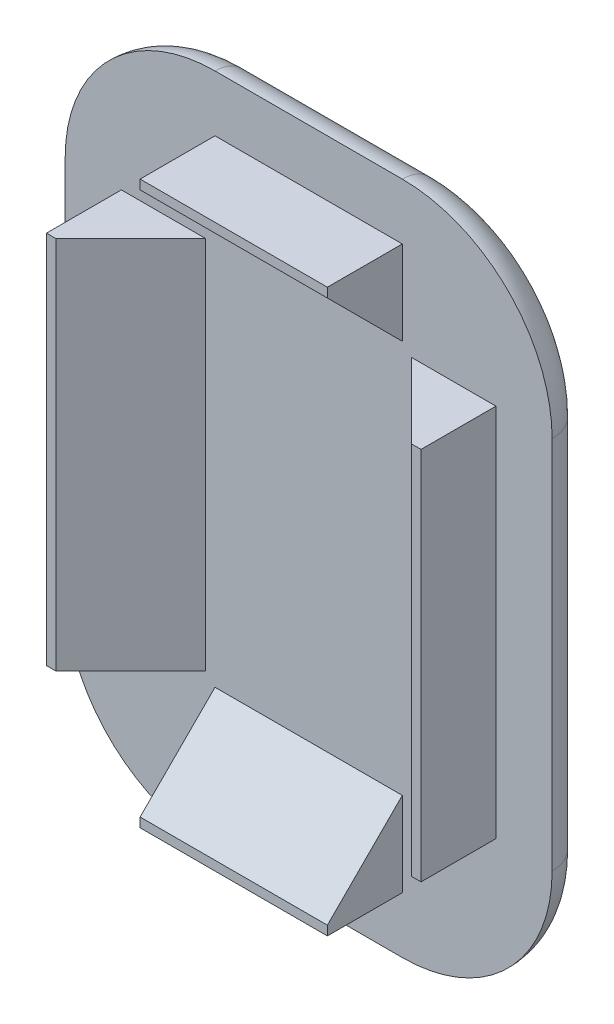
ISO-10303-21;
HEADER;
FILE_DESCRIPTION(('STEP AP214'),'2;1');
FILE_NAME('part.step','',(''),(''),'','','');
FILE_SCHEMA(('AUTOMOTIVE_DESIGN { 1 0 10303 214 1 1 1 1 }'));
ENDSEC;
DATA;
#1=APPLICATION_CONTEXT('core data for automotive mechanical design processes');
#2=APPLICATION_PROTOCOL_DEFINITION('international standard','automotive_design',2000,#1);
#3=PRODUCT_CONTEXT('',#1,'mechanical');
#4=PRODUCT('Part','Part','',(#3));
#5=PRODUCT_RELATED_PRODUCT_CATEGORY('part','',(#4));
#6=PRODUCT_DEFINITION_FORMATION('','',#4);
#7=PRODUCT_DEFINITION_CONTEXT('part definition',#1,'design');
#8=PRODUCT_DEFINITION('design','',#6,#7);
#9=PRODUCT_DEFINITION_SHAPE('','',#8);
#10=(LENGTH_UNIT() NAMED_UNIT(*) SI_UNIT(.MILLI.,.METRE.));
#11=(NAMED_UNIT(*) PLANE_ANGLE_UNIT() SI_UNIT($,.RADIAN.));
#12=(NAMED_UNIT(*) SI_UNIT($,.STERADIAN.) SOLID_ANGLE_UNIT());
#13=UNCERTAINTY_MEASURE_WITH_UNIT(LENGTH_MEASURE(1.E-05),#10,'distance_accuracy_value','');
#14=(GEOMETRIC_REPRESENTATION_CONTEXT(3) GLOBAL_UNCERTAINTY_ASSIGNED_CONTEXT((#13)) GLOBAL_UNIT_ASSIGNED_CONTEXT((#10,
#11,#12)) REPRESENTATION_CONTEXT('',''));
#15=CARTESIAN_POINT('',(0.,0.,0.));
#16=DIRECTION('',(0.,0.,1.));
#17=DIRECTION('',(1.,0.,0.));
#18=AXIS2_PLACEMENT_3D('',#15,#16,#17);
#19=CARTESIAN_POINT('',(-25.8092455426099,-26.5339933976754,2.));
#20=DIRECTION('',(0.,0.,-1.));
#21=DIRECTION('',(-1.,0.,0.));
#22=AXIS2_PLACEMENT_3D('',#19,#20,#21);
#23=PLANE('',#22);
#24=DIRECTION('',(1.,0.,0.));
#25=VECTOR('',#24,1.);
#26=CARTESIAN_POINT('',(-11.30924554261,-26.5339933976754,2.));
#27=LINE('',#26,#25);
#28=CARTESIAN_POINT('',(-15.30924554261,-26.5339933976754,2.));
#29=VERTEX_POINT('',#28);
#30=CARTESIAN_POINT('',(-10.8092455426099,-26.5339933976754,2.));
#31=VERTEX_POINT('',#30);
#32=EDGE_CURVE('E250',#29,#31,#27,.T.);
#33=ORIENTED_EDGE('',*,*,#32,.F.);
#34=DIRECTION('',(0.,1.,0.));
#35=VECTOR('',#34,1.);
#36=CARTESIAN_POINT('',(-15.3092455426099,-6.53399339767552,2.));
#37=LINE('',#36,#35);
#38=CARTESIAN_POINT('',(-15.3092455426099,-6.53399339767553,2.));
#39=VERTEX_POINT('',#38);
#40=EDGE_CURVE('E327',#29,#39,#37,.T.);
#41=ORIENTED_EDGE('',*,*,#40,.T.);
#42=DIRECTION('',(-1.,0.,0.));
#43=VECTOR('',#42,1.);
#44=CARTESIAN_POINT('',(-10.8092455426099,-6.53399339767553,2.));
#45=LINE('',#44,#43);
#46=CARTESIAN_POINT('',(-10.8092455426099,-6.53399339767553,2.));
#47=VERTEX_POINT('',#46);
#48=EDGE_CURVE('E244',#47,#39,#45,.T.);
#49=ORIENTED_EDGE('',*,*,#48,.F.);
#50=DIRECTION('',(0.,1.,0.));
#51=VECTOR('',#50,1.);
#52=CARTESIAN_POINT('',(-10.8092455426099,-26.5339933976754,2.));
#53=LINE('',#52,#51);
#54=EDGE_CURVE('E246',#31,#47,#53,.T.);
#55=ORIENTED_EDGE('',*,*,#54,.F.);
#56=EDGE_LOOP('',(#33,#41,#49,#55));
#57=FACE_BOUND('',#56,.T.);
#58=DIRECTION('',(-1.,0.,0.));
#59=VECTOR('',#58,1.);
#60=CARTESIAN_POINT('',(-30.8092455426099,-6.53399339767553,2.));
#61=LINE('',#60,#59);
#62=CARTESIAN_POINT('',(-26.3092455426099,-6.53399339767553,2.));
#63=VERTEX_POINT('',#62);
#64=CARTESIAN_POINT('',(-30.8092455426099,-6.53399339767554,2.));
#65=VERTEX_POINT('',#64);
#66=EDGE_CURVE('E277',#63,#65,#61,.T.);
#67=ORIENTED_EDGE('',*,*,#66,.F.);
#68=DIRECTION('',(0.,-1.,0.));
#69=VECTOR('',#68,1.);
#70=CARTESIAN_POINT('',(-26.3092455426099,-26.5339933976755,2.));
#71=LINE('',#70,#69);
#72=CARTESIAN_POINT('',(-26.3092455426099,-26.5339933976754,2.));
#73=VERTEX_POINT('',#72);
#74=EDGE_CURVE('E332',#63,#73,#71,.T.);
#75=ORIENTED_EDGE('',*,*,#74,.T.);
#76=DIRECTION('',(1.,0.,0.));
#77=VECTOR('',#76,1.);
#78=CARTESIAN_POINT('',(-30.3092455426099,-26.5339933976754,2.));
#79=LINE('',#78,#77);
#80=CARTESIAN_POINT('',(-30.8092455426099,-26.5339933976754,2.));
#81=VERTEX_POINT('',#80);
#82=EDGE_CURVE('E291',#81,#73,#79,.T.);
#83=ORIENTED_EDGE('',*,*,#82,.F.);
#84=DIRECTION('',(0.,-1.,0.));
#85=VECTOR('',#84,1.);
#86=CARTESIAN_POINT('',(-30.8092455426099,-26.5339933976754,2.));
#87=LINE('',#86,#85);
#88=EDGE_CURVE('E301',#65,#81,#87,.T.);
#89=ORIENTED_EDGE('',*,*,#88,.F.);
#90=EDGE_LOOP('',(#67,#75,#83,#89));
#91=FACE_BOUND('',#90,.T.);
#92=CARTESIAN_POINT('',(-25.8092455426099,-26.5339933976754,2.));
#93=DIRECTION('',(0.,0.,1.));
#94=DIRECTION('',(-1.,0.,0.));
#95=AXIS2_PLACEMENT_3D('',#92,#93,#94);
#96=CIRCLE('',#95,8.);
#97=CARTESIAN_POINT('',(-33.8092455426099,-26.5339933976754,2.));
#98=VERTEX_POINT('',#97);
#99=CARTESIAN_POINT('',(-25.8092455426099,-34.5339933976754,2.));
#100=VERTEX_POINT('',#99);
#101=EDGE_CURVE('E310',#98,#100,#96,.T.);
#102=ORIENTED_EDGE('',*,*,#101,.T.);
#103=DIRECTION('',(1.,0.,0.));
#104=VECTOR('',#103,1.);
#105=CARTESIAN_POINT('',(-25.8092455426099,-34.5339933976754,2.));
#106=LINE('',#105,#104);
#107=CARTESIAN_POINT('',(-15.8092455426099,-34.5339933976754,2.));
#108=VERTEX_POINT('',#107);
#109=EDGE_CURVE('E312',#100,#108,#106,.T.);
#110=ORIENTED_EDGE('',*,*,#109,.T.);
#111=CARTESIAN_POINT('',(-15.8092455426099,-26.5339933976754,2.));
#112=DIRECTION('',(0.,0.,1.));
#113=DIRECTION('',(1.,0.,0.));
#114=AXIS2_PLACEMENT_3D('',#111,#112,#113);
#115=CIRCLE('',#114,8.);
#116=CARTESIAN_POINT('',(-7.80924554260992,-26.5339933976754,2.));
#117=VERTEX_POINT('',#116);
#118=EDGE_CURVE('E314',#108,#117,#115,.T.);
#119=ORIENTED_EDGE('',*,*,#118,.T.);
#120=DIRECTION('',(0.,1.,0.));
#121=VECTOR('',#120,1.);
#122=CARTESIAN_POINT('',(-7.80924554260992,-26.5339933976754,2.));
#123=LINE('',#122,#121);
#124=CARTESIAN_POINT('',(-7.80924554260992,-6.53399339767553,2.));
#125=VERTEX_POINT('',#124);
#126=EDGE_CURVE('E316',#117,#125,#123,.T.);
#127=ORIENTED_EDGE('',*,*,#126,.T.);
#128=CARTESIAN_POINT('',(-15.8092455426099,-6.53399339767553,2.));
#129=DIRECTION('',(0.,0.,1.));
#130=DIRECTION('',(-1.,0.,0.));
#131=AXIS2_PLACEMENT_3D('',#128,#129,#130);
#132=CIRCLE('',#131,8.);
#133=CARTESIAN_POINT('',(-15.8092455426099,1.46600660232447,2.));
#134=VERTEX_POINT('',#133);
#135=EDGE_CURVE('E318',#125,#134,#132,.T.);
#136=ORIENTED_EDGE('',*,*,#135,.T.);
#137=DIRECTION('',(-1.,0.,0.));
#138=VECTOR('',#137,1.);
#139=CARTESIAN_POINT('',(-19.0869152968049,1.46600660232447,2.));
#140=LINE('',#139,#138);
#141=CARTESIAN_POINT('',(-25.8092455426099,1.46600660232447,2.));
#142=VERTEX_POINT('',#141);
#143=EDGE_CURVE('E320',#134,#142,#140,.T.);
#144=ORIENTED_EDGE('',*,*,#143,.T.);
#145=CARTESIAN_POINT('',(-25.8092455426099,-6.53399339767553,2.));
#146=DIRECTION('',(0.,0.,1.));
#147=DIRECTION('',(-1.,0.,0.));
#148=AXIS2_PLACEMENT_3D('',#145,#146,#147);
#149=CIRCLE('',#148,8.);
#150=CARTESIAN_POINT('',(-33.8092455426099,-6.53399339767553,2.));
#151=VERTEX_POINT('',#150);
#152=EDGE_CURVE('E322',#142,#151,#149,.T.);
#153=ORIENTED_EDGE('',*,*,#152,.T.);
#154=DIRECTION('',(0.,-1.,0.));
#155=VECTOR('',#154,1.);
#156=CARTESIAN_POINT('',(-33.8092455426099,-14.5031700446918,2.));
#157=LINE('',#156,#155);
#158=EDGE_CURVE('E325',#151,#98,#157,.T.);
#159=ORIENTED_EDGE('',*,*,#158,.T.);
#160=EDGE_LOOP('',(#102,#110,#119,#127,#136,#144,#153,#159));
#161=FACE_BOUND('',#160,.T.);
#162=DIRECTION('',(0.,-1.,0.));
#163=VECTOR('',#162,1.);
#164=CARTESIAN_POINT('',(-25.8092455426099,-31.5339933976754,2.));
#165=LINE('',#164,#163);
#166=CARTESIAN_POINT('',(-25.8092455426099,-27.0339933976755,2.));
#167=VERTEX_POINT('',#166);
#168=CARTESIAN_POINT('',(-25.8092455426099,-31.5339933976754,2.));
#169=VERTEX_POINT('',#168);
#170=EDGE_CURVE('E274',#167,#169,#165,.T.);
#171=ORIENTED_EDGE('',*,*,#170,.F.);
#172=DIRECTION('',(1.,0.,0.));
#173=VECTOR('',#172,1.);
#174=CARTESIAN_POINT('',(-15.8092455426099,-27.0339933976755,2.));
#175=LINE('',#174,#173);
#176=CARTESIAN_POINT('',(-15.8092455426099,-27.0339933976755,2.));
#177=VERTEX_POINT('',#176);
#178=EDGE_CURVE('E335',#167,#177,#175,.T.);
#179=ORIENTED_EDGE('',*,*,#178,.T.);
#180=DIRECTION('',(0.,1.,0.));
#181=VECTOR('',#180,1.);
#182=CARTESIAN_POINT('',(-15.8092455426099,-31.0339933976754,2.));
#183=LINE('',#182,#181);
#184=CARTESIAN_POINT('',(-15.8092455426099,-31.5339933976754,2.));
#185=VERTEX_POINT('',#184);
#186=EDGE_CURVE('E268',#185,#177,#183,.T.);
#187=ORIENTED_EDGE('',*,*,#186,.F.);
#188=DIRECTION('',(1.,0.,0.));
#189=VECTOR('',#188,1.);
#190=CARTESIAN_POINT('',(-15.8092455426099,-31.5339933976754,2.));
#191=LINE('',#190,#189);
#192=EDGE_CURVE('E270',#169,#185,#191,.T.);
#193=ORIENTED_EDGE('',*,*,#192,.F.);
#194=EDGE_LOOP('',(#171,#179,#187,#193));
#195=FACE_BOUND('',#194,.T.);
#196=DIRECTION('',(0.,1.,0.));
#197=VECTOR('',#196,1.);
#198=CARTESIAN_POINT('',(-15.8092455426099,-2.03399339767559,2.));
#199=LINE('',#198,#197);
#200=CARTESIAN_POINT('',(-15.8092455426099,-6.03399339767557,2.));
#201=VERTEX_POINT('',#200);
#202=CARTESIAN_POINT('',(-15.8092455426099,-1.53399339767553,2.));
#203=VERTEX_POINT('',#202);
#204=EDGE_CURVE('E240',#201,#203,#199,.T.);
#205=ORIENTED_EDGE('',*,*,#204,.F.);
#206=DIRECTION('',(-1.,0.,0.));
#207=VECTOR('',#206,1.);
#208=CARTESIAN_POINT('',(-25.8092455426099,-6.03399339767552,2.));
#209=LINE('',#208,#207);
#210=CARTESIAN_POINT('',(-25.8092455426099,-6.03399339767552,2.));
#211=VERTEX_POINT('',#210);
#212=EDGE_CURVE('E330',#201,#211,#209,.T.);
#213=ORIENTED_EDGE('',*,*,#212,.T.);
#214=DIRECTION('',(0.,-1.,0.));
#215=VECTOR('',#214,1.);
#216=CARTESIAN_POINT('',(-25.8092455426099,-1.53399339767553,2.));
#217=LINE('',#216,#215);
#218=CARTESIAN_POINT('',(-25.8092455426099,-1.53399339767554,2.));
#219=VERTEX_POINT('',#218);
#220=EDGE_CURVE('E209',#219,#211,#217,.T.);
#221=ORIENTED_EDGE('',*,*,#220,.F.);
#222=DIRECTION('',(-1.,0.,0.));
#223=VECTOR('',#222,1.);
#224=CARTESIAN_POINT('',(-15.8092455426099,-1.53399339767553,2.));
#225=LINE('',#224,#223);
#226=EDGE_CURVE('E231',#203,#219,#225,.T.);
#227=ORIENTED_EDGE('',*,*,#226,.F.);
#228=EDGE_LOOP('',(#205,#213,#221,#227));
#229=FACE_BOUND('',#228,.T.);
#230=ADVANCED_FACE('F41',(#57,#91,#161,#195,#229),#23,.F.);
#231=CARTESIAN_POINT('',(-25.8092455426099,-26.5339933976754,0.));
#232=DIRECTION('',(0.,0.,-1.));
#233=DIRECTION('',(-1.,0.,0.));
#234=AXIS2_PLACEMENT_3D('',#231,#232,#233);
#235=PLANE('',#234);
#236=DIRECTION('',(0.,-1.,0.));
#237=VECTOR('',#236,1.);
#238=CARTESIAN_POINT('',(-31.8092455426099,-6.53399339767553,0.));
#239=LINE('',#238,#237);
#240=CARTESIAN_POINT('',(-31.8092455426099,-26.5339933976754,0.));
#241=VERTEX_POINT('',#240);
#242=CARTESIAN_POINT('',(-31.8092455426099,-6.53399339767553,0.));
#243=VERTEX_POINT('',#242);
#244=EDGE_CURVE('E353',#241,#243,#239,.F.);
#245=ORIENTED_EDGE('',*,*,#244,.T.);
#246=CARTESIAN_POINT('',(-25.8092455426099,-6.53399339767553,0.));
#247=DIRECTION('',(0.,0.,-1.));
#248=DIRECTION('',(-1.,0.,0.));
#249=AXIS2_PLACEMENT_3D('',#246,#247,#248);
#250=CIRCLE('',#249,6.);
#251=CARTESIAN_POINT('',(-25.8092455426099,-0.533993397675533,0.));
#252=VERTEX_POINT('',#251);
#253=EDGE_CURVE('E11',#243,#252,#250,.T.);
#254=ORIENTED_EDGE('',*,*,#253,.T.);
#255=DIRECTION('',(-1.,0.,0.));
#256=VECTOR('',#255,1.);
#257=CARTESIAN_POINT('',(-15.8092455426099,-0.533993397675534,0.));
#258=LINE('',#257,#256);
#259=CARTESIAN_POINT('',(-15.8092455426099,-0.533993397675533,0.));
#260=VERTEX_POINT('',#259);
#261=EDGE_CURVE('E50',#252,#260,#258,.F.);
#262=ORIENTED_EDGE('',*,*,#261,.T.);
#263=CARTESIAN_POINT('',(-15.8092455426099,-6.53399339767553,0.));
#264=DIRECTION('',(0.,0.,-1.));
#265=DIRECTION('',(-1.,0.,0.));
#266=AXIS2_PLACEMENT_3D('',#263,#264,#265);
#267=CIRCLE('',#266,6.);
#268=CARTESIAN_POINT('',(-9.80924554260992,-6.53399339767553,0.));
#269=VERTEX_POINT('',#268);
#270=EDGE_CURVE('E363',#260,#269,#267,.T.);
#271=ORIENTED_EDGE('',*,*,#270,.T.);
#272=DIRECTION('',(0.,1.,0.));
#273=VECTOR('',#272,1.);
#274=CARTESIAN_POINT('',(-9.80924554260992,-26.5339933976754,0.));
#275=LINE('',#274,#273);
#276=CARTESIAN_POINT('',(-9.80924554260992,-26.5339933976754,0.));
#277=VERTEX_POINT('',#276);
#278=EDGE_CURVE('E361',#269,#277,#275,.F.);
#279=ORIENTED_EDGE('',*,*,#278,.T.);
#280=CARTESIAN_POINT('',(-15.8092455426099,-26.5339933976754,0.));
#281=DIRECTION('',(0.,0.,-1.));
#282=DIRECTION('',(-1.,0.,0.));
#283=AXIS2_PLACEMENT_3D('',#280,#281,#282);
#284=CIRCLE('',#283,6.);
#285=CARTESIAN_POINT('',(-15.8092455426099,-32.5339933976754,0.));
#286=VERTEX_POINT('',#285);
#287=EDGE_CURVE('E359',#277,#286,#284,.T.);
#288=ORIENTED_EDGE('',*,*,#287,.T.);
#289=DIRECTION('',(1.,0.,0.));
#290=VECTOR('',#289,1.);
#291=CARTESIAN_POINT('',(-25.8092455426099,-32.5339933976754,0.));
#292=LINE('',#291,#290);
#293=CARTESIAN_POINT('',(-25.8092455426099,-32.5339933976754,0.));
#294=VERTEX_POINT('',#293);
#295=EDGE_CURVE('E357',#286,#294,#292,.F.);
#296=ORIENTED_EDGE('',*,*,#295,.T.);
#297=CARTESIAN_POINT('',(-25.8092455426099,-26.5339933976754,0.));
#298=DIRECTION('',(0.,0.,-1.));
#299=DIRECTION('',(-1.,0.,0.));
#300=AXIS2_PLACEMENT_3D('',#297,#298,#299);
#301=CIRCLE('',#300,6.);
#302=EDGE_CURVE('E355',#294,#241,#301,.T.);
#303=ORIENTED_EDGE('',*,*,#302,.T.);
#304=EDGE_LOOP('',(#245,#254,#262,#271,#279,#288,#296,#303));
#305=FACE_BOUND('',#304,.T.);
#306=ADVANCED_FACE('F417',(#305),#235,.T.);
#307=CARTESIAN_POINT('',(-30.8092455426099,-6.53399339767553,6.));
#308=DIRECTION('',(0.,-1.,0.));
#309=DIRECTION('',(1.,0.,0.));
#310=AXIS2_PLACEMENT_3D('',#307,#308,#309);
#311=PLANE('',#310);
#312=ORIENTED_EDGE('',*,*,#66,.T.);
#313=DIRECTION('',(0.,0.,-1.));
#314=VECTOR('',#313,1.);
#315=CARTESIAN_POINT('',(-30.8092455426099,-6.53399339767553,6.));
#316=LINE('',#315,#314);
#317=CARTESIAN_POINT('',(-30.8092455426099,-6.53399339767553,6.));
#318=VERTEX_POINT('',#317);
#319=EDGE_CURVE('E307',#318,#65,#316,.T.);
#320=ORIENTED_EDGE('',*,*,#319,.F.);
#321=DIRECTION('',(-1.,0.,0.));
#322=VECTOR('',#321,1.);
#323=CARTESIAN_POINT('',(-30.8092455426099,-6.53399339767553,6.));
#324=LINE('',#323,#322);
#325=CARTESIAN_POINT('',(-30.3092455426099,-6.53399339767553,6.));
#326=VERTEX_POINT('',#325);
#327=EDGE_CURVE('E290',#326,#318,#324,.T.);
#328=ORIENTED_EDGE('',*,*,#327,.F.);
#329=DIRECTION('',(-0.707106781186544,0.,0.707106781186551));
#330=VECTOR('',#329,1.);
#331=CARTESIAN_POINT('',(-30.5592455426099,-6.53399339767553,6.25000000000004));
#332=LINE('',#331,#330);
#333=EDGE_CURVE('E343',#326,#63,#332,.F.);
#334=ORIENTED_EDGE('',*,*,#333,.T.);
#335=EDGE_LOOP('',(#312,#320,#328,#334));
#336=FACE_BOUND('',#335,.T.);
#337=ADVANCED_FACE('F424',(#336),#311,.F.);
#338=CARTESIAN_POINT('',(-30.8092455426099,-26.5339933976754,6.));
#339=DIRECTION('',(1.,0.,0.));
#340=DIRECTION('',(0.,1.,0.));
#341=AXIS2_PLACEMENT_3D('',#338,#339,#340);
#342=PLANE('',#341);
#343=ORIENTED_EDGE('',*,*,#88,.T.);
#344=DIRECTION('',(0.,0.,-1.));
#345=VECTOR('',#344,1.);
#346=CARTESIAN_POINT('',(-30.8092455426099,-26.5339933976754,6.));
#347=LINE('',#346,#345);
#348=CARTESIAN_POINT('',(-30.8092455426099,-26.5339933976754,6.));
#349=VERTEX_POINT('',#348);
#350=EDGE_CURVE('E298',#349,#81,#347,.T.);
#351=ORIENTED_EDGE('',*,*,#350,.F.);
#352=DIRECTION('',(0.,-1.,0.));
#353=VECTOR('',#352,1.);
#354=CARTESIAN_POINT('',(-30.8092455426099,-26.5339933976754,6.));
#355=LINE('',#354,#353);
#356=EDGE_CURVE('E293',#318,#349,#355,.T.);
#357=ORIENTED_EDGE('',*,*,#356,.F.);
#358=ORIENTED_EDGE('',*,*,#319,.T.);
#359=EDGE_LOOP('',(#343,#351,#357,#358));
#360=FACE_BOUND('',#359,.T.);
#361=ADVANCED_FACE('F534',(#360),#342,.F.);
#362=CARTESIAN_POINT('',(-30.3092455426099,-26.5339933976754,6.));
#363=DIRECTION('',(0.,1.,0.));
#364=DIRECTION('',(0.,0.,1.));
#365=AXIS2_PLACEMENT_3D('',#362,#363,#364);
#366=PLANE('',#365);
#367=ORIENTED_EDGE('',*,*,#82,.T.);
#368=DIRECTION('',(0.707106781186544,0.,-0.707106781186551));
#369=VECTOR('',#368,1.);
#370=CARTESIAN_POINT('',(-30.3092455426099,-26.5339933976754,6.00000000000001));
#371=LINE('',#370,#369);
#372=CARTESIAN_POINT('',(-30.3092455426099,-26.5339933976754,6.));
#373=VERTEX_POINT('',#372);
#374=EDGE_CURVE('E346',#73,#373,#371,.F.);
#375=ORIENTED_EDGE('',*,*,#374,.T.);
#376=DIRECTION('',(1.,0.,0.));
#377=VECTOR('',#376,1.);
#378=CARTESIAN_POINT('',(-30.3092455426099,-26.5339933976754,6.));
#379=LINE('',#378,#377);
#380=EDGE_CURVE('E295',#349,#373,#379,.T.);
#381=ORIENTED_EDGE('',*,*,#380,.F.);
#382=ORIENTED_EDGE('',*,*,#350,.T.);
#383=EDGE_LOOP('',(#367,#375,#381,#382));
#384=FACE_BOUND('',#383,.T.);
#385=ADVANCED_FACE('F531',(#384),#366,.F.);
#386=CARTESIAN_POINT('',(0.,0.,6.));
#387=DIRECTION('',(0.,0.,-1.));
#388=DIRECTION('',(-1.,0.,0.));
#389=AXIS2_PLACEMENT_3D('',#386,#387,#388);
#390=PLANE('',#389);
#391=DIRECTION('',(0.,1.,0.));
#392=VECTOR('',#391,1.);
#393=CARTESIAN_POINT('',(-30.3092455426099,-6.53399339767553,6.));
#394=LINE('',#393,#392);
#395=EDGE_CURVE('E287',#373,#326,#394,.T.);
#396=ORIENTED_EDGE('',*,*,#395,.T.);
#397=ORIENTED_EDGE('',*,*,#327,.T.);
#398=ORIENTED_EDGE('',*,*,#356,.T.);
#399=ORIENTED_EDGE('',*,*,#380,.T.);
#400=EDGE_LOOP('',(#396,#397,#398,#399));
#401=FACE_BOUND('',#400,.T.);
#402=ADVANCED_FACE('F522',(#401),#390,.F.);
#403=CARTESIAN_POINT('',(-25.8092455426099,-31.5339933976754,6.));
#404=DIRECTION('',(1.,0.,0.));
#405=DIRECTION('',(0.,0.,-1.));
#406=AXIS2_PLACEMENT_3D('',#403,#404,#405);
#407=PLANE('',#406);
#408=ORIENTED_EDGE('',*,*,#170,.T.);
#409=DIRECTION('',(0.,0.,-1.));
#410=VECTOR('',#409,1.);
#411=CARTESIAN_POINT('',(-25.8092455426099,-31.5339933976754,6.));
#412=LINE('',#411,#410);
#413=CARTESIAN_POINT('',(-25.8092455426099,-31.5339933976754,6.));
#414=VERTEX_POINT('',#413);
#415=EDGE_CURVE('E253',#414,#169,#412,.T.);
#416=ORIENTED_EDGE('',*,*,#415,.F.);
#417=DIRECTION('',(0.,-1.,0.));
#418=VECTOR('',#417,1.);
#419=CARTESIAN_POINT('',(-25.8092455426099,-31.5339933976754,6.));
#420=LINE('',#419,#418);
#421=CARTESIAN_POINT('',(-25.8092455426099,-31.0339933976754,6.));
#422=VERTEX_POINT('',#421);
#423=EDGE_CURVE('E271',#422,#414,#420,.T.);
#424=ORIENTED_EDGE('',*,*,#423,.F.);
#425=DIRECTION('',(0.,-0.707106781186544,0.707106781186551));
#426=VECTOR('',#425,1.);
#427=CARTESIAN_POINT('',(-25.8092455426099,-31.2839933976754,6.25000000000001));
#428=LINE('',#427,#426);
#429=EDGE_CURVE('E338',#422,#167,#428,.F.);
#430=ORIENTED_EDGE('',*,*,#429,.T.);
#431=EDGE_LOOP('',(#408,#416,#424,#430));
#432=FACE_BOUND('',#431,.T.);
#433=ADVANCED_FACE('F504',(#432),#407,.F.);
#434=CARTESIAN_POINT('',(-15.8092455426099,-31.5339933976754,6.));
#435=DIRECTION('',(0.,1.,0.));
#436=DIRECTION('',(0.,0.,1.));
#437=AXIS2_PLACEMENT_3D('',#434,#435,#436);
#438=PLANE('',#437);
#439=ORIENTED_EDGE('',*,*,#192,.T.);
#440=DIRECTION('',(0.,0.,-1.));
#441=VECTOR('',#440,1.);
#442=CARTESIAN_POINT('',(-15.8092455426099,-31.5339933976754,6.));
#443=LINE('',#442,#441);
#444=CARTESIAN_POINT('',(-15.8092455426099,-31.5339933976754,6.));
#445=VERTEX_POINT('',#444);
#446=EDGE_CURVE('E264',#445,#185,#443,.T.);
#447=ORIENTED_EDGE('',*,*,#446,.F.);
#448=DIRECTION('',(1.,0.,0.));
#449=VECTOR('',#448,1.);
#450=CARTESIAN_POINT('',(-15.8092455426099,-31.5339933976754,6.));
#451=LINE('',#450,#449);
#452=EDGE_CURVE('E283',#414,#445,#451,.T.);
#453=ORIENTED_EDGE('',*,*,#452,.F.);
#454=ORIENTED_EDGE('',*,*,#415,.T.);
#455=EDGE_LOOP('',(#439,#447,#453,#454));
#456=FACE_BOUND('',#455,.T.);
#457=ADVANCED_FACE('F513',(#456),#438,.F.);
#458=CARTESIAN_POINT('',(-15.8092455426099,-31.0339933976754,6.));
#459=DIRECTION('',(-1.,0.,0.));
#460=DIRECTION('',(0.,0.,1.));
#461=AXIS2_PLACEMENT_3D('',#458,#459,#460);
#462=PLANE('',#461);
#463=ORIENTED_EDGE('',*,*,#186,.T.);
#464=DIRECTION('',(0.,0.707106781186544,-0.707106781186551));
#465=VECTOR('',#464,1.);
#466=CARTESIAN_POINT('',(-15.8092455426099,-31.0339933976754,6.00000000000001));
#467=LINE('',#466,#465);
#468=CARTESIAN_POINT('',(-15.8092455426099,-31.0339933976754,6.));
#469=VERTEX_POINT('',#468);
#470=EDGE_CURVE('E341',#177,#469,#467,.F.);
#471=ORIENTED_EDGE('',*,*,#470,.T.);
#472=DIRECTION('',(0.,1.,0.));
#473=VECTOR('',#472,1.);
#474=CARTESIAN_POINT('',(-15.8092455426099,-31.0339933976754,6.));
#475=LINE('',#474,#473);
#476=EDGE_CURVE('E280',#445,#469,#475,.T.);
#477=ORIENTED_EDGE('',*,*,#476,.F.);
#478=ORIENTED_EDGE('',*,*,#446,.T.);
#479=EDGE_LOOP('',(#463,#471,#477,#478));
#480=FACE_BOUND('',#479,.T.);
#481=ADVANCED_FACE('F508',(#480),#462,.F.);
#482=CARTESIAN_POINT('',(0.,0.,6.));
#483=DIRECTION('',(0.,0.,-1.));
#484=DIRECTION('',(-1.,0.,0.));
#485=AXIS2_PLACEMENT_3D('',#482,#483,#484);
#486=PLANE('',#485);
#487=ORIENTED_EDGE('',*,*,#423,.T.);
#488=ORIENTED_EDGE('',*,*,#452,.T.);
#489=ORIENTED_EDGE('',*,*,#476,.T.);
#490=DIRECTION('',(-1.,0.,0.));
#491=VECTOR('',#490,1.);
#492=CARTESIAN_POINT('',(-25.8092455426099,-31.0339933976754,6.));
#493=LINE('',#492,#491);
#494=EDGE_CURVE('E267',#469,#422,#493,.T.);
#495=ORIENTED_EDGE('',*,*,#494,.T.);
#496=EDGE_LOOP('',(#487,#488,#489,#495));
#497=FACE_BOUND('',#496,.T.);
#498=ADVANCED_FACE('F510',(#497),#486,.F.);
#499=CARTESIAN_POINT('',(-11.30924554261,-26.5339933976754,6.));
#500=DIRECTION('',(0.,1.,0.));
#501=DIRECTION('',(0.,0.,1.));
#502=AXIS2_PLACEMENT_3D('',#499,#500,#501);
#503=PLANE('',#502);
#504=ORIENTED_EDGE('',*,*,#32,.T.);
#505=DIRECTION('',(0.,0.,-1.));
#506=VECTOR('',#505,1.);
#507=CARTESIAN_POINT('',(-10.8092455426099,-26.5339933976754,6.));
#508=LINE('',#507,#506);
#509=CARTESIAN_POINT('',(-10.8092455426099,-26.5339933976754,6.));
#510=VERTEX_POINT('',#509);
#511=EDGE_CURVE('E236',#510,#31,#508,.T.);
#512=ORIENTED_EDGE('',*,*,#511,.F.);
#513=DIRECTION('',(1.,0.,0.));
#514=VECTOR('',#513,1.);
#515=CARTESIAN_POINT('',(-11.30924554261,-26.5339933976754,6.));
#516=LINE('',#515,#514);
#517=CARTESIAN_POINT('',(-11.30924554261,-26.5339933976754,6.));
#518=VERTEX_POINT('',#517);
#519=EDGE_CURVE('E258',#518,#510,#516,.T.);
#520=ORIENTED_EDGE('',*,*,#519,.F.);
#521=DIRECTION('',(0.707106781186544,0.,0.707106781186551));
#522=VECTOR('',#521,1.);
#523=CARTESIAN_POINT('',(-11.30924554261,-26.5339933976754,6.00000000000001));
#524=LINE('',#523,#522);
#525=EDGE_CURVE('E214',#518,#29,#524,.F.);
#526=ORIENTED_EDGE('',*,*,#525,.T.);
#527=EDGE_LOOP('',(#504,#512,#520,#526));
#528=FACE_BOUND('',#527,.T.);
#529=ADVANCED_FACE('F528',(#528),#503,.F.);
#530=CARTESIAN_POINT('',(-10.8092455426099,-26.5339933976754,6.));
#531=DIRECTION('',(-1.,0.,0.));
#532=DIRECTION('',(0.,-1.,0.));
#533=AXIS2_PLACEMENT_3D('',#530,#531,#532);
#534=PLANE('',#533);
#535=ORIENTED_EDGE('',*,*,#54,.T.);
#536=DIRECTION('',(0.,0.,-1.));
#537=VECTOR('',#536,1.);
#538=CARTESIAN_POINT('',(-10.8092455426099,-6.53399339767553,6.));
#539=LINE('',#538,#537);
#540=CARTESIAN_POINT('',(-10.8092455426099,-6.53399339767553,6.));
#541=VERTEX_POINT('',#540);
#542=EDGE_CURVE('E239',#541,#47,#539,.T.);
#543=ORIENTED_EDGE('',*,*,#542,.F.);
#544=DIRECTION('',(0.,1.,0.));
#545=VECTOR('',#544,1.);
#546=CARTESIAN_POINT('',(-10.8092455426099,-26.5339933976754,6.));
#547=LINE('',#546,#545);
#548=EDGE_CURVE('E256',#510,#541,#547,.T.);
#549=ORIENTED_EDGE('',*,*,#548,.F.);
#550=ORIENTED_EDGE('',*,*,#511,.T.);
#551=EDGE_LOOP('',(#535,#543,#549,#550));
#552=FACE_BOUND('',#551,.T.);
#553=ADVANCED_FACE('F582',(#552),#534,.F.);
#554=CARTESIAN_POINT('',(-10.8092455426099,-6.53399339767553,6.));
#555=DIRECTION('',(0.,-1.,0.));
#556=DIRECTION('',(0.,0.,-1.));
#557=AXIS2_PLACEMENT_3D('',#554,#555,#556);
#558=PLANE('',#557);
#559=ORIENTED_EDGE('',*,*,#48,.T.);
#560=DIRECTION('',(-0.707106781186544,0.,-0.707106781186551));
#561=VECTOR('',#560,1.);
#562=CARTESIAN_POINT('',(-11.0592455426099,-6.53399339767553,6.25000000000001));
#563=LINE('',#562,#561);
#564=CARTESIAN_POINT('',(-11.3092455426099,-6.53399339767553,6.));
#565=VERTEX_POINT('',#564);
#566=EDGE_CURVE('E351',#39,#565,#563,.F.);
#567=ORIENTED_EDGE('',*,*,#566,.T.);
#568=DIRECTION('',(-1.,0.,0.));
#569=VECTOR('',#568,1.);
#570=CARTESIAN_POINT('',(-10.8092455426099,-6.53399339767553,6.));
#571=LINE('',#570,#569);
#572=EDGE_CURVE('E243',#541,#565,#571,.T.);
#573=ORIENTED_EDGE('',*,*,#572,.F.);
#574=ORIENTED_EDGE('',*,*,#542,.T.);
#575=EDGE_LOOP('',(#559,#567,#573,#574));
#576=FACE_BOUND('',#575,.T.);
#577=ADVANCED_FACE('F589',(#576),#558,.F.);
#578=CARTESIAN_POINT('',(0.,0.,6.));
#579=DIRECTION('',(0.,0.,1.));
#580=DIRECTION('',(1.,0.,0.));
#581=AXIS2_PLACEMENT_3D('',#578,#579,#580);
#582=PLANE('',#581);
#583=DIRECTION('',(0.,-1.,0.));
#584=VECTOR('',#583,1.);
#585=CARTESIAN_POINT('',(-11.3092455426099,-6.53399339767553,6.));
#586=LINE('',#585,#584);
#587=EDGE_CURVE('E247',#565,#518,#586,.T.);
#588=ORIENTED_EDGE('',*,*,#587,.T.);
#589=ORIENTED_EDGE('',*,*,#519,.T.);
#590=ORIENTED_EDGE('',*,*,#548,.T.);
#591=ORIENTED_EDGE('',*,*,#572,.T.);
#592=EDGE_LOOP('',(#588,#589,#590,#591));
#593=FACE_BOUND('',#592,.T.);
#594=ADVANCED_FACE('F414',(#593),#582,.T.);
#595=CARTESIAN_POINT('',(-15.8092455426099,-2.03399339767559,6.));
#596=DIRECTION('',(-1.,0.,0.));
#597=DIRECTION('',(0.,0.,1.));
#598=AXIS2_PLACEMENT_3D('',#595,#596,#597);
#599=PLANE('',#598);
#600=ORIENTED_EDGE('',*,*,#204,.T.);
#601=DIRECTION('',(0.,0.,-1.));
#602=VECTOR('',#601,1.);
#603=CARTESIAN_POINT('',(-15.8092455426099,-1.53399339767553,6.));
#604=LINE('',#603,#602);
#605=CARTESIAN_POINT('',(-15.8092455426099,-1.53399339767553,6.));
#606=VERTEX_POINT('',#605);
#607=EDGE_CURVE('E387',#606,#203,#604,.T.);
#608=ORIENTED_EDGE('',*,*,#607,.F.);
#609=DIRECTION('',(0.,1.,0.));
#610=VECTOR('',#609,1.);
#611=CARTESIAN_POINT('',(-15.8092455426099,-2.03399339767559,6.));
#612=LINE('',#611,#610);
#613=CARTESIAN_POINT('',(-15.8092455426099,-2.03399339767559,6.));
#614=VERTEX_POINT('',#613);
#615=EDGE_CURVE('E229',#614,#606,#612,.T.);
#616=ORIENTED_EDGE('',*,*,#615,.F.);
#617=DIRECTION('',(0.,0.707106781186544,0.707106781186551));
#618=VECTOR('',#617,1.);
#619=CARTESIAN_POINT('',(-15.8092455426099,-2.0339933976756,6.00000000000001));
#620=LINE('',#619,#618);
#621=EDGE_CURVE('E215',#614,#201,#620,.F.);
#622=ORIENTED_EDGE('',*,*,#621,.T.);
#623=EDGE_LOOP('',(#600,#608,#616,#622));
#624=FACE_BOUND('',#623,.T.);
#625=ADVANCED_FACE('F402',(#624),#599,.F.);
#626=CARTESIAN_POINT('',(-15.8092455426099,-1.53399339767553,6.));
#627=DIRECTION('',(0.,-1.,0.));
#628=DIRECTION('',(0.,0.,-1.));
#629=AXIS2_PLACEMENT_3D('',#626,#627,#628);
#630=PLANE('',#629);
#631=ORIENTED_EDGE('',*,*,#226,.T.);
#632=DIRECTION('',(0.,0.,-1.));
#633=VECTOR('',#632,1.);
#634=CARTESIAN_POINT('',(-25.8092455426099,-1.53399339767553,6.));
#635=LINE('',#634,#633);
#636=CARTESIAN_POINT('',(-25.8092455426099,-1.53399339767553,6.));
#637=VERTEX_POINT('',#636);
#638=EDGE_CURVE('E224',#637,#219,#635,.T.);
#639=ORIENTED_EDGE('',*,*,#638,.F.);
#640=DIRECTION('',(-1.,0.,0.));
#641=VECTOR('',#640,1.);
#642=CARTESIAN_POINT('',(-15.8092455426099,-1.53399339767553,6.));
#643=LINE('',#642,#641);
#644=EDGE_CURVE('E222',#606,#637,#643,.T.);
#645=ORIENTED_EDGE('',*,*,#644,.F.);
#646=ORIENTED_EDGE('',*,*,#607,.T.);
#647=EDGE_LOOP('',(#631,#639,#645,#646));
#648=FACE_BOUND('',#647,.T.);
#649=ADVANCED_FACE('F404',(#648),#630,.F.);
#650=CARTESIAN_POINT('',(-25.8092455426099,-1.53399339767553,6.));
#651=DIRECTION('',(1.,0.,0.));
#652=DIRECTION('',(0.,0.,-1.));
#653=AXIS2_PLACEMENT_3D('',#650,#651,#652);
#654=PLANE('',#653);
#655=ORIENTED_EDGE('',*,*,#220,.T.);
#656=DIRECTION('',(0.,-0.707106781186544,-0.707106781186551));
#657=VECTOR('',#656,1.);
#658=CARTESIAN_POINT('',(-25.8092455426099,-1.78399339767554,6.25000000000001));
#659=LINE('',#658,#657);
#660=CARTESIAN_POINT('',(-25.8092455426099,-2.03399339767553,6.));
#661=VERTEX_POINT('',#660);
#662=EDGE_CURVE('E204',#211,#661,#659,.F.);
#663=ORIENTED_EDGE('',*,*,#662,.T.);
#664=DIRECTION('',(0.,-1.,0.));
#665=VECTOR('',#664,1.);
#666=CARTESIAN_POINT('',(-25.8092455426099,-1.53399339767553,6.));
#667=LINE('',#666,#665);
#668=EDGE_CURVE('E208',#637,#661,#667,.T.);
#669=ORIENTED_EDGE('',*,*,#668,.F.);
#670=ORIENTED_EDGE('',*,*,#638,.T.);
#671=EDGE_LOOP('',(#655,#663,#669,#670));
#672=FACE_BOUND('',#671,.T.);
#673=ADVANCED_FACE('F206',(#672),#654,.F.);
#674=CARTESIAN_POINT('',(0.,0.,6.));
#675=DIRECTION('',(0.,0.,1.));
#676=DIRECTION('',(1.,0.,0.));
#677=AXIS2_PLACEMENT_3D('',#674,#675,#676);
#678=PLANE('',#677);
#679=DIRECTION('',(1.,0.,0.));
#680=VECTOR('',#679,1.);
#681=CARTESIAN_POINT('',(-25.8092455426099,-2.03399339767553,6.));
#682=LINE('',#681,#680);
#683=EDGE_CURVE('E220',#661,#614,#682,.T.);
#684=ORIENTED_EDGE('',*,*,#683,.T.);
#685=ORIENTED_EDGE('',*,*,#615,.T.);
#686=ORIENTED_EDGE('',*,*,#644,.T.);
#687=ORIENTED_EDGE('',*,*,#668,.T.);
#688=EDGE_LOOP('',(#684,#685,#686,#687));
#689=FACE_BOUND('',#688,.T.);
#690=ADVANCED_FACE('F219',(#689),#678,.T.);
#691=CARTESIAN_POINT('',(-25.8092455426099,-31.0339933976754,6.00000000000002));
#692=DIRECTION('',(0.,0.707106781186551,0.707106781186544));
#693=DIRECTION('',(1.,0.,0.));
#694=AXIS2_PLACEMENT_3D('',#691,#692,#693);
#695=PLANE('',#694);
#696=ORIENTED_EDGE('',*,*,#470,.F.);
#697=ORIENTED_EDGE('',*,*,#178,.F.);
#698=ORIENTED_EDGE('',*,*,#429,.F.);
#699=ORIENTED_EDGE('',*,*,#494,.F.);
#700=EDGE_LOOP('',(#696,#697,#698,#699));
#701=FACE_BOUND('',#700,.T.);
#702=ADVANCED_FACE('F431',(#701),#695,.T.);
#703=CARTESIAN_POINT('',(-30.3092455426099,-6.53399339767553,6.00000000000002));
#704=DIRECTION('',(0.707106781186551,0.,0.707106781186544));
#705=DIRECTION('',(0.,-1.,0.));
#706=AXIS2_PLACEMENT_3D('',#703,#704,#705);
#707=PLANE('',#706);
#708=ORIENTED_EDGE('',*,*,#374,.F.);
#709=ORIENTED_EDGE('',*,*,#74,.F.);
#710=ORIENTED_EDGE('',*,*,#333,.F.);
#711=ORIENTED_EDGE('',*,*,#395,.F.);
#712=EDGE_LOOP('',(#708,#709,#710,#711));
#713=FACE_BOUND('',#712,.T.);
#714=ADVANCED_FACE('F437',(#713),#707,.T.);
#715=CARTESIAN_POINT('',(-25.8092455426099,-2.03399339767553,6.00000000000002));
#716=DIRECTION('',(0.,-0.707106781186551,0.707106781186544));
#717=DIRECTION('',(-1.,0.,0.));
#718=AXIS2_PLACEMENT_3D('',#715,#716,#717);
#719=PLANE('',#718);
#720=ORIENTED_EDGE('',*,*,#662,.F.);
#721=ORIENTED_EDGE('',*,*,#212,.F.);
#722=ORIENTED_EDGE('',*,*,#621,.F.);
#723=ORIENTED_EDGE('',*,*,#683,.F.);
#724=EDGE_LOOP('',(#720,#721,#722,#723));
#725=FACE_BOUND('',#724,.T.);
#726=ADVANCED_FACE('F226',(#725),#719,.T.);
#727=CARTESIAN_POINT('',(-11.3092455426099,-6.53399339767553,6.00000000000002));
#728=DIRECTION('',(-0.707106781186551,0.,0.707106781186544));
#729=DIRECTION('',(0.,1.,0.));
#730=AXIS2_PLACEMENT_3D('',#727,#728,#729);
#731=PLANE('',#730);
#732=ORIENTED_EDGE('',*,*,#566,.F.);
#733=ORIENTED_EDGE('',*,*,#40,.F.);
#734=ORIENTED_EDGE('',*,*,#525,.F.);
#735=ORIENTED_EDGE('',*,*,#587,.F.);
#736=EDGE_LOOP('',(#732,#733,#734,#735));
#737=FACE_BOUND('',#736,.T.);
#738=ADVANCED_FACE('F450',(#737),#731,.T.);
#739=CARTESIAN_POINT('',(-15.8092455426099,-26.5339933976754,2.));
#740=DIRECTION('',(0.,0.,-1.));
#741=DIRECTION('',(-1.,0.,0.));
#742=AXIS2_PLACEMENT_3D('',#739,#740,#741);
#743=TOROIDAL_SURFACE('',#742,6.,2.);
#744=CARTESIAN_POINT('',(-15.8092455426099,-32.5339933976754,2.));
#745=DIRECTION('',(-1.,0.,0.));
#746=DIRECTION('',(0.,0.,1.));
#747=AXIS2_PLACEMENT_3D('',#744,#745,#746);
#748=CIRCLE('',#747,2.);
#749=EDGE_CURVE('E380',#286,#108,#748,.T.);
#750=ORIENTED_EDGE('',*,*,#749,.F.);
#751=ORIENTED_EDGE('',*,*,#287,.F.);
#752=CARTESIAN_POINT('',(-9.80924554260992,-26.5339933976754,2.));
#753=DIRECTION('',(0.,1.,0.));
#754=DIRECTION('',(0.,0.,1.));
#755=AXIS2_PLACEMENT_3D('',#752,#753,#754);
#756=CIRCLE('',#755,2.);
#757=EDGE_CURVE('E45',#117,#277,#756,.T.);
#758=ORIENTED_EDGE('',*,*,#757,.F.);
#759=ORIENTED_EDGE('',*,*,#118,.F.);
#760=EDGE_LOOP('',(#750,#751,#758,#759));
#761=FACE_BOUND('',#760,.T.);
#762=ADVANCED_FACE('F43',(#761),#743,.T.);
#763=CARTESIAN_POINT('',(-9.80924554260992,-14.5031700446918,2.));
#764=DIRECTION('',(0.,-1.,0.));
#765=DIRECTION('',(0.,0.,-1.));
#766=AXIS2_PLACEMENT_3D('',#763,#764,#765);
#767=CYLINDRICAL_SURFACE('',#766,2.);
#768=ORIENTED_EDGE('',*,*,#757,.T.);
#769=ORIENTED_EDGE('',*,*,#278,.F.);
#770=CARTESIAN_POINT('',(-9.80924554260992,-6.53399339767553,2.));
#771=DIRECTION('',(0.,1.,0.));
#772=DIRECTION('',(0.,0.,1.));
#773=AXIS2_PLACEMENT_3D('',#770,#771,#772);
#774=CIRCLE('',#773,2.);
#775=EDGE_CURVE('E378',#125,#269,#774,.T.);
#776=ORIENTED_EDGE('',*,*,#775,.F.);
#777=ORIENTED_EDGE('',*,*,#126,.F.);
#778=EDGE_LOOP('',(#768,#769,#776,#777));
#779=FACE_BOUND('',#778,.T.);
#780=ADVANCED_FACE('F476',(#779),#767,.T.);
#781=CARTESIAN_POINT('',(-19.0869152968049,-32.5339933976754,2.));
#782=DIRECTION('',(-1.,0.,0.));
#783=DIRECTION('',(0.,0.,1.));
#784=AXIS2_PLACEMENT_3D('',#781,#782,#783);
#785=CYLINDRICAL_SURFACE('',#784,2.);
#786=ORIENTED_EDGE('',*,*,#749,.T.);
#787=ORIENTED_EDGE('',*,*,#109,.F.);
#788=CARTESIAN_POINT('',(-25.8092455426099,-32.5339933976754,2.));
#789=DIRECTION('',(-1.,0.,0.));
#790=DIRECTION('',(0.,0.,1.));
#791=AXIS2_PLACEMENT_3D('',#788,#789,#790);
#792=CIRCLE('',#791,2.);
#793=EDGE_CURVE('E375',#294,#100,#792,.T.);
#794=ORIENTED_EDGE('',*,*,#793,.F.);
#795=ORIENTED_EDGE('',*,*,#295,.F.);
#796=EDGE_LOOP('',(#786,#787,#794,#795));
#797=FACE_BOUND('',#796,.T.);
#798=ADVANCED_FACE('F473',(#797),#785,.T.);
#799=CARTESIAN_POINT('',(-15.8092455426099,-6.53399339767553,2.));
#800=DIRECTION('',(0.,0.,-1.));
#801=DIRECTION('',(-1.,0.,0.));
#802=AXIS2_PLACEMENT_3D('',#799,#800,#801);
#803=TOROIDAL_SURFACE('',#802,6.,2.);
#804=ORIENTED_EDGE('',*,*,#775,.T.);
#805=ORIENTED_EDGE('',*,*,#270,.F.);
#806=CARTESIAN_POINT('',(-15.8092455426099,-0.533993397675533,2.));
#807=DIRECTION('',(-1.,0.,0.));
#808=DIRECTION('',(0.,0.,1.));
#809=AXIS2_PLACEMENT_3D('',#806,#807,#808);
#810=CIRCLE('',#809,2.);
#811=EDGE_CURVE('E372',#134,#260,#810,.T.);
#812=ORIENTED_EDGE('',*,*,#811,.F.);
#813=ORIENTED_EDGE('',*,*,#135,.F.);
#814=EDGE_LOOP('',(#804,#805,#812,#813));
#815=FACE_BOUND('',#814,.T.);
#816=ADVANCED_FACE('F469',(#815),#803,.T.);
#817=CARTESIAN_POINT('',(-25.8092455426099,-26.5339933976754,2.));
#818=DIRECTION('',(0.,0.,-1.));
#819=DIRECTION('',(-1.,0.,0.));
#820=AXIS2_PLACEMENT_3D('',#817,#818,#819);
#821=TOROIDAL_SURFACE('',#820,6.,2.);
#822=ORIENTED_EDGE('',*,*,#793,.T.);
#823=ORIENTED_EDGE('',*,*,#101,.F.);
#824=CARTESIAN_POINT('',(-31.8092455426099,-26.5339933976754,2.));
#825=DIRECTION('',(0.,1.,0.));
#826=DIRECTION('',(0.,0.,1.));
#827=AXIS2_PLACEMENT_3D('',#824,#825,#826);
#828=CIRCLE('',#827,2.);
#829=EDGE_CURVE('E369',#241,#98,#828,.T.);
#830=ORIENTED_EDGE('',*,*,#829,.F.);
#831=ORIENTED_EDGE('',*,*,#302,.F.);
#832=EDGE_LOOP('',(#822,#823,#830,#831));
#833=FACE_BOUND('',#832,.T.);
#834=ADVANCED_FACE('F465',(#833),#821,.T.);
#835=CARTESIAN_POINT('',(-25.8092455426099,-0.533993397675533,2.));
#836=DIRECTION('',(1.,0.,0.));
#837=DIRECTION('',(0.,1.,0.));
#838=AXIS2_PLACEMENT_3D('',#835,#836,#837);
#839=CYLINDRICAL_SURFACE('',#838,2.);
#840=ORIENTED_EDGE('',*,*,#811,.T.);
#841=ORIENTED_EDGE('',*,*,#261,.F.);
#842=CARTESIAN_POINT('',(-25.8092455426099,-0.533993397675533,2.));
#843=DIRECTION('',(-1.,0.,0.));
#844=DIRECTION('',(0.,0.,1.));
#845=AXIS2_PLACEMENT_3D('',#842,#843,#844);
#846=CIRCLE('',#845,2.);
#847=EDGE_CURVE('E58',#142,#252,#846,.T.);
#848=ORIENTED_EDGE('',*,*,#847,.F.);
#849=ORIENTED_EDGE('',*,*,#143,.F.);
#850=EDGE_LOOP('',(#840,#841,#848,#849));
#851=FACE_BOUND('',#850,.T.);
#852=ADVANCED_FACE('F461',(#851),#839,.T.);
#853=CARTESIAN_POINT('',(-31.8092455426099,-26.5339933976754,2.));
#854=DIRECTION('',(0.,1.,0.));
#855=DIRECTION('',(0.,0.,1.));
#856=AXIS2_PLACEMENT_3D('',#853,#854,#855);
#857=CYLINDRICAL_SURFACE('',#856,2.);
#858=ORIENTED_EDGE('',*,*,#829,.T.);
#859=ORIENTED_EDGE('',*,*,#158,.F.);
#860=CARTESIAN_POINT('',(-31.8092455426099,-6.53399339767553,2.));
#861=DIRECTION('',(0.,1.,0.));
#862=DIRECTION('',(0.,0.,1.));
#863=AXIS2_PLACEMENT_3D('',#860,#861,#862);
#864=CIRCLE('',#863,2.);
#865=EDGE_CURVE('E366',#243,#151,#864,.T.);
#866=ORIENTED_EDGE('',*,*,#865,.F.);
#867=ORIENTED_EDGE('',*,*,#244,.F.);
#868=EDGE_LOOP('',(#858,#859,#866,#867));
#869=FACE_BOUND('',#868,.T.);
#870=ADVANCED_FACE('F458',(#869),#857,.T.);
#871=CARTESIAN_POINT('',(-25.8092455426099,-6.53399339767553,2.));
#872=DIRECTION('',(0.,0.,-1.));
#873=DIRECTION('',(-1.,0.,0.));
#874=AXIS2_PLACEMENT_3D('',#871,#872,#873);
#875=TOROIDAL_SURFACE('',#874,6.,2.);
#876=ORIENTED_EDGE('',*,*,#847,.T.);
#877=ORIENTED_EDGE('',*,*,#253,.F.);
#878=ORIENTED_EDGE('',*,*,#865,.T.);
#879=ORIENTED_EDGE('',*,*,#152,.F.);
#880=EDGE_LOOP('',(#876,#877,#878,#879));
#881=FACE_BOUND('',#880,.T.);
#882=ADVANCED_FACE('F455',(#881),#875,.T.);
#883=CLOSED_SHELL('',(#230,#306,#337,#361,#385,#402,#433,#457,#481,#498,#529,#553,#577,#594,
#625,#649,#673,#690,#702,#714,#726,#738,#762,#780,#798,#816,#834,#852,#870,#882));
#884=MANIFOLD_SOLID_BREP('B2',#883);
#885=ADVANCED_BREP_SHAPE_REPRESENTATION('',(#18,#884),#14);
#886=SHAPE_DEFINITION_REPRESENTATION(#9,#885);
ENDSEC;
END-ISO-10303-21;
